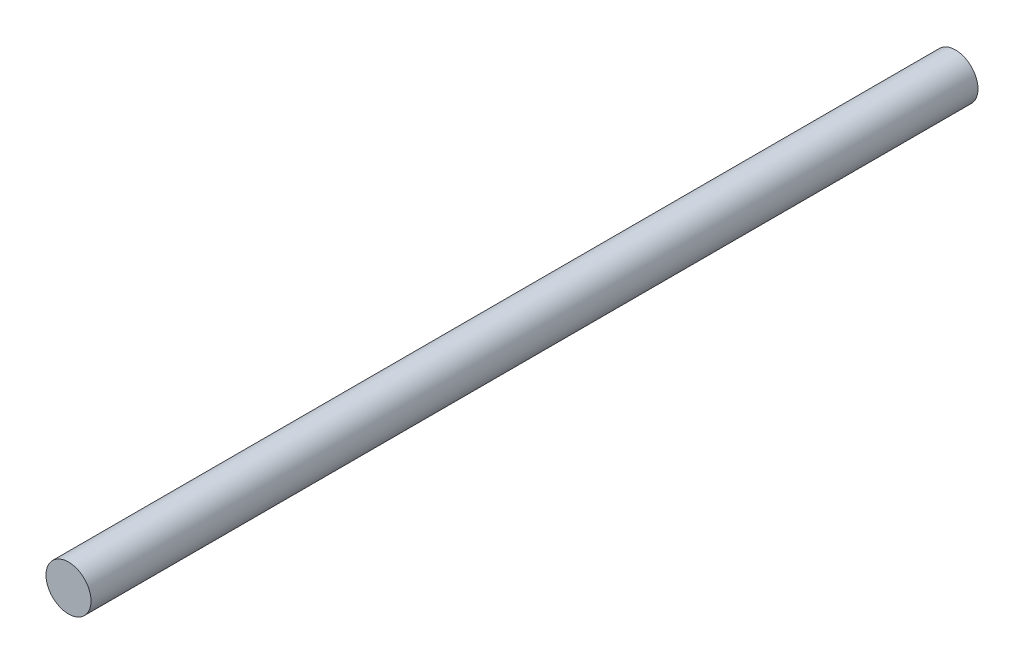
ISO-10303-21;
HEADER;
FILE_DESCRIPTION(('STEP AP214'),'2;1');
FILE_NAME('part.step','',(''),(''),'','','');
FILE_SCHEMA(('AUTOMOTIVE_DESIGN { 1 0 10303 214 1 1 1 1 }'));
ENDSEC;
DATA;
#1=APPLICATION_CONTEXT('core data for automotive mechanical design processes');
#2=APPLICATION_PROTOCOL_DEFINITION('international standard','automotive_design',2000,#1);
#3=PRODUCT_CONTEXT('',#1,'mechanical');
#4=PRODUCT('Part','Part','',(#3));
#5=PRODUCT_RELATED_PRODUCT_CATEGORY('part','',(#4));
#6=PRODUCT_DEFINITION_FORMATION('','',#4);
#7=PRODUCT_DEFINITION_CONTEXT('part definition',#1,'design');
#8=PRODUCT_DEFINITION('design','',#6,#7);
#9=PRODUCT_DEFINITION_SHAPE('','',#8);
#10=(LENGTH_UNIT() NAMED_UNIT(*) SI_UNIT(.MILLI.,.METRE.));
#11=(NAMED_UNIT(*) PLANE_ANGLE_UNIT() SI_UNIT($,.RADIAN.));
#12=(NAMED_UNIT(*) SI_UNIT($,.STERADIAN.) SOLID_ANGLE_UNIT());
#13=UNCERTAINTY_MEASURE_WITH_UNIT(LENGTH_MEASURE(1.E-05),#10,'distance_accuracy_value','');
#14=(GEOMETRIC_REPRESENTATION_CONTEXT(3) GLOBAL_UNCERTAINTY_ASSIGNED_CONTEXT((#13)) GLOBAL_UNIT_ASSIGNED_CONTEXT((#10,
#11,#12)) REPRESENTATION_CONTEXT('',''));
#15=CARTESIAN_POINT('',(0.,0.,0.));
#16=DIRECTION('',(0.,0.,1.));
#17=DIRECTION('',(1.,0.,0.));
#18=AXIS2_PLACEMENT_3D('',#15,#16,#17);
#19=CARTESIAN_POINT('',(0.,0.,78.12532));
#20=DIRECTION('',(0.,0.,-1.));
#21=DIRECTION('',(-1.,0.,0.));
#22=AXIS2_PLACEMENT_3D('',#19,#20,#21);
#23=CYLINDRICAL_SURFACE('',#22,1.984375);
#24=CARTESIAN_POINT('',(0.,0.,78.12532));
#25=DIRECTION('',(0.,0.,1.));
#26=DIRECTION('',(1.,0.,0.));
#27=AXIS2_PLACEMENT_3D('',#24,#25,#26);
#28=CIRCLE('',#27,1.984375);
#29=CARTESIAN_POINT('',(1.984375,0.,78.12532));
#30=VERTEX_POINT('',#29);
#31=EDGE_CURVE('E10',#30,#30,#28,.T.);
#32=ORIENTED_EDGE('',*,*,#31,.F.);
#33=EDGE_LOOP('',(#32));
#34=FACE_BOUND('',#33,.T.);
#35=CARTESIAN_POINT('',(0.,0.,0.));
#36=DIRECTION('',(0.,0.,1.));
#37=DIRECTION('',(1.,0.,0.));
#38=AXIS2_PLACEMENT_3D('',#35,#36,#37);
#39=CIRCLE('',#38,1.984375);
#40=CARTESIAN_POINT('',(1.984375,0.,0.));
#41=VERTEX_POINT('',#40);
#42=EDGE_CURVE('E40',#41,#41,#39,.T.);
#43=ORIENTED_EDGE('',*,*,#42,.T.);
#44=EDGE_LOOP('',(#43));
#45=FACE_BOUND('',#44,.T.);
#46=ADVANCED_FACE('F37',(#34,#45),#23,.T.);
#47=CARTESIAN_POINT('',(0.,0.,78.12532));
#48=DIRECTION('',(0.,0.,1.));
#49=DIRECTION('',(1.,0.,0.));
#50=AXIS2_PLACEMENT_3D('',#47,#48,#49);
#51=PLANE('',#50);
#52=ORIENTED_EDGE('',*,*,#31,.T.);
#53=EDGE_LOOP('',(#52));
#54=FACE_BOUND('',#53,.T.);
#55=ADVANCED_FACE('F54',(#54),#51,.T.);
#56=CARTESIAN_POINT('',(0.,0.,0.));
#57=DIRECTION('',(0.,0.,1.));
#58=DIRECTION('',(1.,0.,0.));
#59=AXIS2_PLACEMENT_3D('',#56,#57,#58);
#60=PLANE('',#59);
#61=ORIENTED_EDGE('',*,*,#42,.F.);
#62=EDGE_LOOP('',(#61));
#63=FACE_BOUND('',#62,.T.);
#64=ADVANCED_FACE('F52',(#63),#60,.F.);
#65=CLOSED_SHELL('',(#46,#55,#64));
#66=MANIFOLD_SOLID_BREP('B2',#65);
#67=ADVANCED_BREP_SHAPE_REPRESENTATION('',(#18,#66),#14);
#68=SHAPE_DEFINITION_REPRESENTATION(#9,#67);
ENDSEC;
END-ISO-10303-21;
